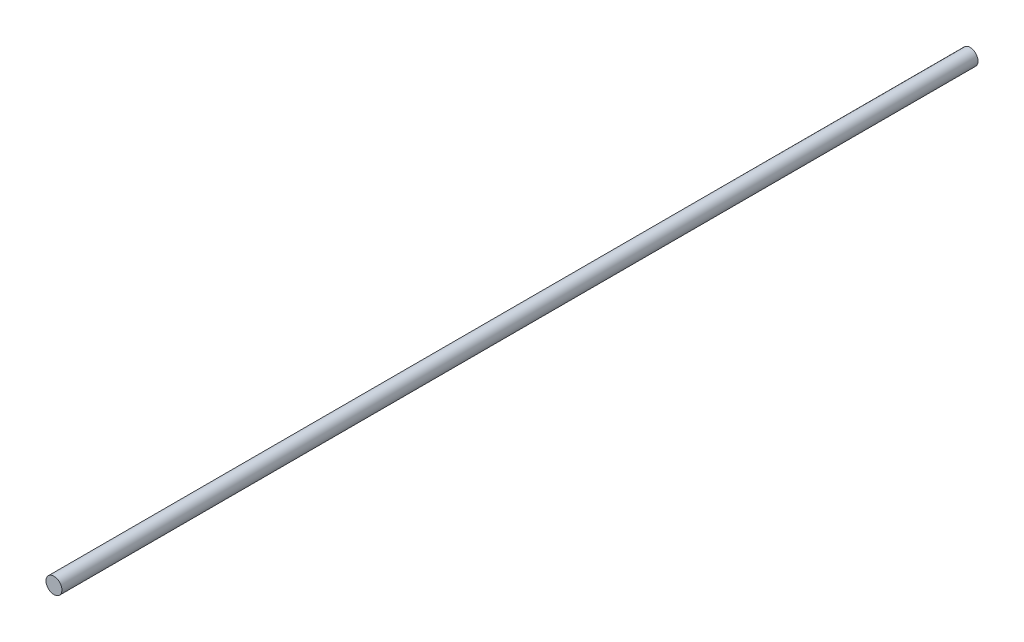
ISO-10303-21;
HEADER;
FILE_DESCRIPTION(('STEP AP214'),'2;1');
FILE_NAME('part.step','',(''),(''),'','','');
FILE_SCHEMA(('AUTOMOTIVE_DESIGN { 1 0 10303 214 1 1 1 1 }'));
ENDSEC;
DATA;
#1=APPLICATION_CONTEXT('core data for automotive mechanical design processes');
#2=APPLICATION_PROTOCOL_DEFINITION('international standard','automotive_design',2000,#1);
#3=PRODUCT_CONTEXT('',#1,'mechanical');
#4=PRODUCT('Part','Part','',(#3));
#5=PRODUCT_RELATED_PRODUCT_CATEGORY('part','',(#4));
#6=PRODUCT_DEFINITION_FORMATION('','',#4);
#7=PRODUCT_DEFINITION_CONTEXT('part definition',#1,'design');
#8=PRODUCT_DEFINITION('design','',#6,#7);
#9=PRODUCT_DEFINITION_SHAPE('','',#8);
#10=(LENGTH_UNIT() NAMED_UNIT(*) SI_UNIT(.MILLI.,.METRE.));
#11=(NAMED_UNIT(*) PLANE_ANGLE_UNIT() SI_UNIT($,.RADIAN.));
#12=(NAMED_UNIT(*) SI_UNIT($,.STERADIAN.) SOLID_ANGLE_UNIT());
#13=UNCERTAINTY_MEASURE_WITH_UNIT(LENGTH_MEASURE(1.E-05),#10,'distance_accuracy_value','');
#14=(GEOMETRIC_REPRESENTATION_CONTEXT(3) GLOBAL_UNCERTAINTY_ASSIGNED_CONTEXT((#13)) GLOBAL_UNIT_ASSIGNED_CONTEXT((#10,
#11,#12)) REPRESENTATION_CONTEXT('',''));
#15=CARTESIAN_POINT('',(0.,0.,0.));
#16=DIRECTION('',(0.,0.,1.));
#17=DIRECTION('',(1.,0.,0.));
#18=AXIS2_PLACEMENT_3D('',#15,#16,#17);
#19=CARTESIAN_POINT('',(0.,0.,460.));
#20=DIRECTION('',(0.,0.,-1.));
#21=DIRECTION('',(-1.,0.,0.));
#22=AXIS2_PLACEMENT_3D('',#19,#20,#21);
#23=CYLINDRICAL_SURFACE('',#22,4.);
#24=CARTESIAN_POINT('',(0.,0.,460.));
#25=DIRECTION('',(0.,0.,1.));
#26=DIRECTION('',(1.,0.,0.));
#27=AXIS2_PLACEMENT_3D('',#24,#25,#26);
#28=CIRCLE('',#27,4.);
#29=CARTESIAN_POINT('',(4.,0.,460.));
#30=VERTEX_POINT('',#29);
#31=EDGE_CURVE('E10',#30,#30,#28,.T.);
#32=ORIENTED_EDGE('',*,*,#31,.F.);
#33=EDGE_LOOP('',(#32));
#34=FACE_BOUND('',#33,.T.);
#35=CARTESIAN_POINT('',(0.,0.,0.));
#36=DIRECTION('',(0.,0.,1.));
#37=DIRECTION('',(1.,0.,0.));
#38=AXIS2_PLACEMENT_3D('',#35,#36,#37);
#39=CIRCLE('',#38,4.);
#40=CARTESIAN_POINT('',(4.,0.,0.));
#41=VERTEX_POINT('',#40);
#42=EDGE_CURVE('E34',#41,#41,#39,.T.);
#43=ORIENTED_EDGE('',*,*,#42,.T.);
#44=EDGE_LOOP('',(#43));
#45=FACE_BOUND('',#44,.T.);
#46=ADVANCED_FACE('F31',(#34,#45),#23,.T.);
#47=CARTESIAN_POINT('',(0.,0.,460.));
#48=DIRECTION('',(0.,0.,1.));
#49=DIRECTION('',(1.,0.,0.));
#50=AXIS2_PLACEMENT_3D('',#47,#48,#49);
#51=PLANE('',#50);
#52=ORIENTED_EDGE('',*,*,#31,.T.);
#53=EDGE_LOOP('',(#52));
#54=FACE_BOUND('',#53,.T.);
#55=ADVANCED_FACE('F46',(#54),#51,.T.);
#56=CARTESIAN_POINT('',(0.,0.,0.));
#57=DIRECTION('',(0.,0.,1.));
#58=DIRECTION('',(1.,0.,0.));
#59=AXIS2_PLACEMENT_3D('',#56,#57,#58);
#60=PLANE('',#59);
#61=ORIENTED_EDGE('',*,*,#42,.F.);
#62=EDGE_LOOP('',(#61));
#63=FACE_BOUND('',#62,.T.);
#64=ADVANCED_FACE('F44',(#63),#60,.F.);
#65=CLOSED_SHELL('',(#46,#55,#64));
#66=MANIFOLD_SOLID_BREP('B2',#65);
#67=ADVANCED_BREP_SHAPE_REPRESENTATION('',(#18,#66),#14);
#68=SHAPE_DEFINITION_REPRESENTATION(#9,#67);
ENDSEC;
END-ISO-10303-21;
